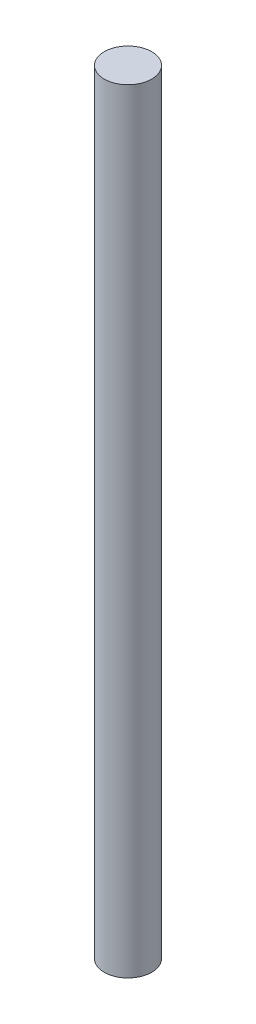
ISO-10303-21;
HEADER;
FILE_DESCRIPTION(('STEP AP214'),'2;1');
FILE_NAME('part.step','',(''),(''),'','','');
FILE_SCHEMA(('AUTOMOTIVE_DESIGN { 1 0 10303 214 1 1 1 1 }'));
ENDSEC;
DATA;
#1=APPLICATION_CONTEXT('core data for automotive mechanical design processes');
#2=APPLICATION_PROTOCOL_DEFINITION('international standard','automotive_design',2000,#1);
#3=PRODUCT_CONTEXT('',#1,'mechanical');
#4=PRODUCT('Part','Part','',(#3));
#5=PRODUCT_RELATED_PRODUCT_CATEGORY('part','',(#4));
#6=PRODUCT_DEFINITION_FORMATION('','',#4);
#7=PRODUCT_DEFINITION_CONTEXT('part definition',#1,'design');
#8=PRODUCT_DEFINITION('design','',#6,#7);
#9=PRODUCT_DEFINITION_SHAPE('','',#8);
#10=(LENGTH_UNIT() NAMED_UNIT(*) SI_UNIT(.MILLI.,.METRE.));
#11=(NAMED_UNIT(*) PLANE_ANGLE_UNIT() SI_UNIT($,.RADIAN.));
#12=(NAMED_UNIT(*) SI_UNIT($,.STERADIAN.) SOLID_ANGLE_UNIT());
#13=UNCERTAINTY_MEASURE_WITH_UNIT(LENGTH_MEASURE(1.E-05),#10,'distance_accuracy_value','');
#14=(GEOMETRIC_REPRESENTATION_CONTEXT(3) GLOBAL_UNCERTAINTY_ASSIGNED_CONTEXT((#13)) GLOBAL_UNIT_ASSIGNED_CONTEXT((#10,
#11,#12)) REPRESENTATION_CONTEXT('',''));
#15=CARTESIAN_POINT('',(0.,0.,0.));
#16=DIRECTION('',(0.,0.,1.));
#17=DIRECTION('',(1.,0.,0.));
#18=AXIS2_PLACEMENT_3D('',#15,#16,#17);
#19=CARTESIAN_POINT('',(0.,0.,0.));
#20=DIRECTION('',(0.,1.,0.));
#21=DIRECTION('',(0.,0.,1.));
#22=AXIS2_PLACEMENT_3D('',#19,#20,#21);
#23=PLANE('',#22);
#24=CARTESIAN_POINT('',(0.,0.,0.));
#25=DIRECTION('',(0.,1.,0.));
#26=DIRECTION('',(0.,0.,1.));
#27=AXIS2_PLACEMENT_3D('',#24,#25,#26);
#28=CIRCLE('',#27,6.75);
#29=CARTESIAN_POINT('',(0.,0.,6.75));
#30=VERTEX_POINT('',#29);
#31=EDGE_CURVE('E39',#30,#30,#28,.T.);
#32=ORIENTED_EDGE('',*,*,#31,.F.);
#33=EDGE_LOOP('',(#32));
#34=FACE_BOUND('',#33,.T.);
#35=ADVANCED_FACE('F32',(#34),#23,.F.);
#36=CARTESIAN_POINT('',(0.,220.,0.));
#37=DIRECTION('',(0.,1.,0.));
#38=DIRECTION('',(0.,0.,1.));
#39=AXIS2_PLACEMENT_3D('',#36,#37,#38);
#40=PLANE('',#39);
#41=CARTESIAN_POINT('',(0.,220.,0.));
#42=DIRECTION('',(0.,1.,0.));
#43=DIRECTION('',(0.,0.,1.));
#44=AXIS2_PLACEMENT_3D('',#41,#42,#43);
#45=CIRCLE('',#44,6.75);
#46=CARTESIAN_POINT('',(0.,220.,6.75));
#47=VERTEX_POINT('',#46);
#48=EDGE_CURVE('E11',#47,#47,#45,.T.);
#49=ORIENTED_EDGE('',*,*,#48,.T.);
#50=EDGE_LOOP('',(#49));
#51=FACE_BOUND('',#50,.T.);
#52=ADVANCED_FACE('F46',(#51),#40,.T.);
#53=CARTESIAN_POINT('',(0.,0.,0.));
#54=DIRECTION('',(0.,1.,0.));
#55=DIRECTION('',(0.,0.,1.));
#56=AXIS2_PLACEMENT_3D('',#53,#54,#55);
#57=CYLINDRICAL_SURFACE('',#56,6.75);
#58=ORIENTED_EDGE('',*,*,#48,.F.);
#59=EDGE_LOOP('',(#58));
#60=FACE_BOUND('',#59,.T.);
#61=ORIENTED_EDGE('',*,*,#31,.T.);
#62=EDGE_LOOP('',(#61));
#63=FACE_BOUND('',#62,.T.);
#64=ADVANCED_FACE('F48',(#60,#63),#57,.T.);
#65=CLOSED_SHELL('',(#35,#52,#64));
#66=MANIFOLD_SOLID_BREP('B2',#65);
#67=ADVANCED_BREP_SHAPE_REPRESENTATION('',(#18,#66),#14);
#68=SHAPE_DEFINITION_REPRESENTATION(#9,#67);
ENDSEC;
END-ISO-10303-21;
